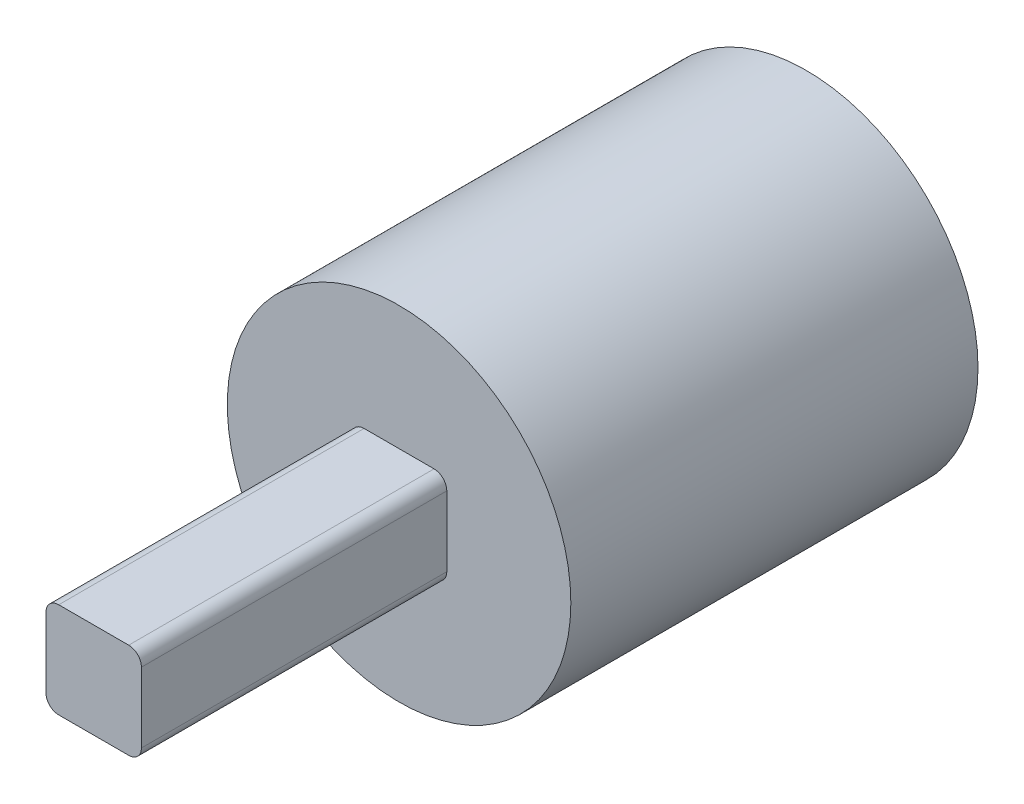
ISO-10303-21;
HEADER;
FILE_DESCRIPTION(('STEP AP214'),'2;1');
FILE_NAME('part.step','',(''),(''),'','','');
FILE_SCHEMA(('AUTOMOTIVE_DESIGN { 1 0 10303 214 1 1 1 1 }'));
ENDSEC;
DATA;
#1=APPLICATION_CONTEXT('core data for automotive mechanical design processes');
#2=APPLICATION_PROTOCOL_DEFINITION('international standard','automotive_design',2000,#1);
#3=PRODUCT_CONTEXT('',#1,'mechanical');
#4=PRODUCT('Part','Part','',(#3));
#5=PRODUCT_RELATED_PRODUCT_CATEGORY('part','',(#4));
#6=PRODUCT_DEFINITION_FORMATION('','',#4);
#7=PRODUCT_DEFINITION_CONTEXT('part definition',#1,'design');
#8=PRODUCT_DEFINITION('design','',#6,#7);
#9=PRODUCT_DEFINITION_SHAPE('','',#8);
#10=(LENGTH_UNIT() NAMED_UNIT(*) SI_UNIT(.MILLI.,.METRE.));
#11=(NAMED_UNIT(*) PLANE_ANGLE_UNIT() SI_UNIT($,.RADIAN.));
#12=(NAMED_UNIT(*) SI_UNIT($,.STERADIAN.) SOLID_ANGLE_UNIT());
#13=UNCERTAINTY_MEASURE_WITH_UNIT(LENGTH_MEASURE(1.E-05),#10,'distance_accuracy_value','');
#14=(GEOMETRIC_REPRESENTATION_CONTEXT(3) GLOBAL_UNCERTAINTY_ASSIGNED_CONTEXT((#13)) GLOBAL_UNIT_ASSIGNED_CONTEXT((#10,
#11,#12)) REPRESENTATION_CONTEXT('',''));
#15=CARTESIAN_POINT('',(0.,0.,0.));
#16=DIRECTION('',(0.,0.,1.));
#17=DIRECTION('',(1.,0.,0.));
#18=AXIS2_PLACEMENT_3D('',#15,#16,#17);
#19=CARTESIAN_POINT('',(0.,0.,32.));
#20=DIRECTION('',(0.,0.,-1.));
#21=DIRECTION('',(-1.,0.,0.));
#22=AXIS2_PLACEMENT_3D('',#19,#20,#21);
#23=CYLINDRICAL_SURFACE('',#22,13.5);
#24=CARTESIAN_POINT('',(0.,0.,32.));
#25=DIRECTION('',(0.,0.,1.));
#26=DIRECTION('',(1.,0.,0.));
#27=AXIS2_PLACEMENT_3D('',#24,#25,#26);
#28=CIRCLE('',#27,13.5);
#29=CARTESIAN_POINT('',(13.5,0.,32.));
#30=VERTEX_POINT('',#29);
#31=EDGE_CURVE('E11',#30,#30,#28,.T.);
#32=ORIENTED_EDGE('',*,*,#31,.F.);
#33=EDGE_LOOP('',(#32));
#34=FACE_BOUND('',#33,.T.);
#35=CARTESIAN_POINT('',(0.,0.,0.));
#36=DIRECTION('',(0.,0.,1.));
#37=DIRECTION('',(1.,0.,0.));
#38=AXIS2_PLACEMENT_3D('',#35,#36,#37);
#39=CIRCLE('',#38,13.5);
#40=CARTESIAN_POINT('',(13.5,0.,0.));
#41=VERTEX_POINT('',#40);
#42=EDGE_CURVE('E42',#41,#41,#39,.T.);
#43=ORIENTED_EDGE('',*,*,#42,.T.);
#44=EDGE_LOOP('',(#43));
#45=FACE_BOUND('',#44,.T.);
#46=ADVANCED_FACE('F39',(#34,#45),#23,.T.);
#47=CARTESIAN_POINT('',(0.,0.,32.));
#48=DIRECTION('',(0.,0.,1.));
#49=DIRECTION('',(1.,0.,0.));
#50=AXIS2_PLACEMENT_3D('',#47,#48,#49);
#51=PLANE('',#50);
#52=CARTESIAN_POINT('',(-2.75,-2.75,32.));
#53=DIRECTION('',(0.,0.,1.));
#54=DIRECTION('',(-1.,0.,0.));
#55=AXIS2_PLACEMENT_3D('',#52,#53,#54);
#56=CIRCLE('',#55,1.);
#57=CARTESIAN_POINT('',(-3.75,-2.75,32.));
#58=VERTEX_POINT('',#57);
#59=CARTESIAN_POINT('',(-2.75,-3.75,32.));
#60=VERTEX_POINT('',#59);
#61=EDGE_CURVE('E54',#58,#60,#56,.T.);
#62=ORIENTED_EDGE('',*,*,#61,.F.);
#63=DIRECTION('',(0.,-1.,0.));
#64=VECTOR('',#63,1.);
#65=CARTESIAN_POINT('',(-3.75,-2.75,32.));
#66=LINE('',#65,#64);
#67=CARTESIAN_POINT('',(-3.75,2.75,32.));
#68=VERTEX_POINT('',#67);
#69=EDGE_CURVE('E58',#68,#58,#66,.T.);
#70=ORIENTED_EDGE('',*,*,#69,.F.);
#71=CARTESIAN_POINT('',(-2.75,2.75,32.));
#72=DIRECTION('',(0.,0.,1.));
#73=DIRECTION('',(-1.,0.,0.));
#74=AXIS2_PLACEMENT_3D('',#71,#72,#73);
#75=CIRCLE('',#74,1.);
#76=CARTESIAN_POINT('',(-2.75,3.75,32.));
#77=VERTEX_POINT('',#76);
#78=EDGE_CURVE('E158',#77,#68,#75,.T.);
#79=ORIENTED_EDGE('',*,*,#78,.F.);
#80=DIRECTION('',(-1.,0.,0.));
#81=VECTOR('',#80,1.);
#82=CARTESIAN_POINT('',(-2.75,3.75,32.));
#83=LINE('',#82,#81);
#84=CARTESIAN_POINT('',(2.75,3.75,32.));
#85=VERTEX_POINT('',#84);
#86=EDGE_CURVE('E161',#85,#77,#83,.T.);
#87=ORIENTED_EDGE('',*,*,#86,.F.);
#88=CARTESIAN_POINT('',(2.75,2.75,32.));
#89=DIRECTION('',(0.,0.,1.));
#90=DIRECTION('',(-1.,0.,0.));
#91=AXIS2_PLACEMENT_3D('',#88,#89,#90);
#92=CIRCLE('',#91,1.);
#93=CARTESIAN_POINT('',(3.75,2.75,32.));
#94=VERTEX_POINT('',#93);
#95=EDGE_CURVE('E165',#94,#85,#92,.T.);
#96=ORIENTED_EDGE('',*,*,#95,.F.);
#97=DIRECTION('',(0.,1.,0.));
#98=VECTOR('',#97,1.);
#99=CARTESIAN_POINT('',(3.75,-2.75,32.));
#100=LINE('',#99,#98);
#101=CARTESIAN_POINT('',(3.75,-2.75,32.));
#102=VERTEX_POINT('',#101);
#103=EDGE_CURVE('E169',#102,#94,#100,.T.);
#104=ORIENTED_EDGE('',*,*,#103,.F.);
#105=CARTESIAN_POINT('',(2.75,-2.75,32.));
#106=DIRECTION('',(0.,0.,1.));
#107=DIRECTION('',(1.,0.,0.));
#108=AXIS2_PLACEMENT_3D('',#105,#106,#107);
#109=CIRCLE('',#108,1.);
#110=CARTESIAN_POINT('',(2.75,-3.75,32.));
#111=VERTEX_POINT('',#110);
#112=EDGE_CURVE('E173',#111,#102,#109,.T.);
#113=ORIENTED_EDGE('',*,*,#112,.F.);
#114=DIRECTION('',(1.,0.,0.));
#115=VECTOR('',#114,1.);
#116=CARTESIAN_POINT('',(-2.75,-3.75,32.));
#117=LINE('',#116,#115);
#118=EDGE_CURVE('E177',#60,#111,#117,.T.);
#119=ORIENTED_EDGE('',*,*,#118,.F.);
#120=EDGE_LOOP('',(#62,#70,#79,#87,#96,#104,#113,#119));
#121=FACE_BOUND('',#120,.T.);
#122=ORIENTED_EDGE('',*,*,#31,.T.);
#123=EDGE_LOOP('',(#122));
#124=FACE_BOUND('',#123,.T.);
#125=ADVANCED_FACE('F227',(#121,#124),#51,.T.);
#126=CARTESIAN_POINT('',(0.,0.,0.));
#127=DIRECTION('',(0.,0.,1.));
#128=DIRECTION('',(1.,0.,0.));
#129=AXIS2_PLACEMENT_3D('',#126,#127,#128);
#130=PLANE('',#129);
#131=ORIENTED_EDGE('',*,*,#42,.F.);
#132=EDGE_LOOP('',(#131));
#133=FACE_BOUND('',#132,.T.);
#134=ADVANCED_FACE('F232',(#133),#130,.F.);
#135=CARTESIAN_POINT('',(-2.75,-2.75,56.));
#136=DIRECTION('',(0.,0.,-1.));
#137=DIRECTION('',(-1.,0.,0.));
#138=AXIS2_PLACEMENT_3D('',#135,#136,#137);
#139=CYLINDRICAL_SURFACE('',#138,1.);
#140=ORIENTED_EDGE('',*,*,#61,.T.);
#141=DIRECTION('',(0.,0.,-1.));
#142=VECTOR('',#141,1.);
#143=CARTESIAN_POINT('',(-2.75,-3.75,56.));
#144=LINE('',#143,#142);
#145=CARTESIAN_POINT('',(-2.75,-3.75,56.));
#146=VERTEX_POINT('',#145);
#147=EDGE_CURVE('E107',#146,#60,#144,.T.);
#148=ORIENTED_EDGE('',*,*,#147,.F.);
#149=CARTESIAN_POINT('',(-2.75,-2.75,56.));
#150=DIRECTION('',(0.,0.,1.));
#151=DIRECTION('',(-1.,0.,0.));
#152=AXIS2_PLACEMENT_3D('',#149,#150,#151);
#153=CIRCLE('',#152,1.);
#154=CARTESIAN_POINT('',(-3.75,-2.75,56.));
#155=VERTEX_POINT('',#154);
#156=EDGE_CURVE('E114',#155,#146,#153,.T.);
#157=ORIENTED_EDGE('',*,*,#156,.F.);
#158=DIRECTION('',(0.,0.,-1.));
#159=VECTOR('',#158,1.);
#160=CARTESIAN_POINT('',(-3.75,-2.75,56.));
#161=LINE('',#160,#159);
#162=EDGE_CURVE('E153',#155,#58,#161,.T.);
#163=ORIENTED_EDGE('',*,*,#162,.T.);
#164=EDGE_LOOP('',(#140,#148,#157,#163));
#165=FACE_BOUND('',#164,.T.);
#166=ADVANCED_FACE('F125',(#165),#139,.T.);
#167=CARTESIAN_POINT('',(-2.75,-3.75,56.));
#168=DIRECTION('',(0.,1.,0.));
#169=DIRECTION('',(-1.,0.,0.));
#170=AXIS2_PLACEMENT_3D('',#167,#168,#169);
#171=PLANE('',#170);
#172=ORIENTED_EDGE('',*,*,#118,.T.);
#173=DIRECTION('',(0.,0.,-1.));
#174=VECTOR('',#173,1.);
#175=CARTESIAN_POINT('',(2.75,-3.75,56.));
#176=LINE('',#175,#174);
#177=CARTESIAN_POINT('',(2.75,-3.75,56.));
#178=VERTEX_POINT('',#177);
#179=EDGE_CURVE('E109',#178,#111,#176,.T.);
#180=ORIENTED_EDGE('',*,*,#179,.F.);
#181=DIRECTION('',(1.,0.,0.));
#182=VECTOR('',#181,1.);
#183=CARTESIAN_POINT('',(-2.75,-3.75,56.));
#184=LINE('',#183,#182);
#185=EDGE_CURVE('E102',#146,#178,#184,.T.);
#186=ORIENTED_EDGE('',*,*,#185,.F.);
#187=ORIENTED_EDGE('',*,*,#147,.T.);
#188=EDGE_LOOP('',(#172,#180,#186,#187));
#189=FACE_BOUND('',#188,.T.);
#190=ADVANCED_FACE('F105',(#189),#171,.F.);
#191=CARTESIAN_POINT('',(2.75,-2.75,56.));
#192=DIRECTION('',(0.,0.,-1.));
#193=DIRECTION('',(-1.,0.,0.));
#194=AXIS2_PLACEMENT_3D('',#191,#192,#193);
#195=CYLINDRICAL_SURFACE('',#194,1.);
#196=ORIENTED_EDGE('',*,*,#112,.T.);
#197=DIRECTION('',(0.,0.,-1.));
#198=VECTOR('',#197,1.);
#199=CARTESIAN_POINT('',(3.75,-2.75,56.));
#200=LINE('',#199,#198);
#201=CARTESIAN_POINT('',(3.75,-2.75,56.));
#202=VERTEX_POINT('',#201);
#203=EDGE_CURVE('E131',#202,#102,#200,.T.);
#204=ORIENTED_EDGE('',*,*,#203,.F.);
#205=CARTESIAN_POINT('',(2.75,-2.75,56.));
#206=DIRECTION('',(0.,0.,1.));
#207=DIRECTION('',(1.,0.,0.));
#208=AXIS2_PLACEMENT_3D('',#205,#206,#207);
#209=CIRCLE('',#208,1.);
#210=EDGE_CURVE('E113',#178,#202,#209,.T.);
#211=ORIENTED_EDGE('',*,*,#210,.F.);
#212=ORIENTED_EDGE('',*,*,#179,.T.);
#213=EDGE_LOOP('',(#196,#204,#211,#212));
#214=FACE_BOUND('',#213,.T.);
#215=ADVANCED_FACE('F201',(#214),#195,.T.);
#216=CARTESIAN_POINT('',(3.75,-2.75,56.));
#217=DIRECTION('',(-1.,0.,0.));
#218=DIRECTION('',(0.,0.,1.));
#219=AXIS2_PLACEMENT_3D('',#216,#217,#218);
#220=PLANE('',#219);
#221=ORIENTED_EDGE('',*,*,#103,.T.);
#222=DIRECTION('',(0.,0.,-1.));
#223=VECTOR('',#222,1.);
#224=CARTESIAN_POINT('',(3.75,2.75,56.));
#225=LINE('',#224,#223);
#226=CARTESIAN_POINT('',(3.75,2.75,56.));
#227=VERTEX_POINT('',#226);
#228=EDGE_CURVE('E137',#227,#94,#225,.T.);
#229=ORIENTED_EDGE('',*,*,#228,.F.);
#230=DIRECTION('',(0.,1.,0.));
#231=VECTOR('',#230,1.);
#232=CARTESIAN_POINT('',(3.75,-2.75,56.));
#233=LINE('',#232,#231);
#234=EDGE_CURVE('E193',#202,#227,#233,.T.);
#235=ORIENTED_EDGE('',*,*,#234,.F.);
#236=ORIENTED_EDGE('',*,*,#203,.T.);
#237=EDGE_LOOP('',(#221,#229,#235,#236));
#238=FACE_BOUND('',#237,.T.);
#239=ADVANCED_FACE('F203',(#238),#220,.F.);
#240=CARTESIAN_POINT('',(2.75,2.75,56.));
#241=DIRECTION('',(0.,0.,-1.));
#242=DIRECTION('',(-1.,0.,0.));
#243=AXIS2_PLACEMENT_3D('',#240,#241,#242);
#244=CYLINDRICAL_SURFACE('',#243,1.);
#245=ORIENTED_EDGE('',*,*,#95,.T.);
#246=DIRECTION('',(0.,0.,-1.));
#247=VECTOR('',#246,1.);
#248=CARTESIAN_POINT('',(2.75,3.75,56.));
#249=LINE('',#248,#247);
#250=CARTESIAN_POINT('',(2.75,3.75,56.));
#251=VERTEX_POINT('',#250);
#252=EDGE_CURVE('E141',#251,#85,#249,.T.);
#253=ORIENTED_EDGE('',*,*,#252,.F.);
#254=CARTESIAN_POINT('',(2.75,2.75,56.));
#255=DIRECTION('',(0.,0.,1.));
#256=DIRECTION('',(-1.,0.,0.));
#257=AXIS2_PLACEMENT_3D('',#254,#255,#256);
#258=CIRCLE('',#257,1.);
#259=EDGE_CURVE('E190',#227,#251,#258,.T.);
#260=ORIENTED_EDGE('',*,*,#259,.F.);
#261=ORIENTED_EDGE('',*,*,#228,.T.);
#262=EDGE_LOOP('',(#245,#253,#260,#261));
#263=FACE_BOUND('',#262,.T.);
#264=ADVANCED_FACE('F207',(#263),#244,.T.);
#265=CARTESIAN_POINT('',(-2.75,3.75,56.));
#266=DIRECTION('',(0.,-1.,0.));
#267=DIRECTION('',(1.,0.,0.));
#268=AXIS2_PLACEMENT_3D('',#265,#266,#267);
#269=PLANE('',#268);
#270=ORIENTED_EDGE('',*,*,#86,.T.);
#271=DIRECTION('',(0.,0.,-1.));
#272=VECTOR('',#271,1.);
#273=CARTESIAN_POINT('',(-2.75,3.75,56.));
#274=LINE('',#273,#272);
#275=CARTESIAN_POINT('',(-2.75,3.75,56.));
#276=VERTEX_POINT('',#275);
#277=EDGE_CURVE('E145',#276,#77,#274,.T.);
#278=ORIENTED_EDGE('',*,*,#277,.F.);
#279=DIRECTION('',(-1.,0.,0.));
#280=VECTOR('',#279,1.);
#281=CARTESIAN_POINT('',(-2.75,3.75,56.));
#282=LINE('',#281,#280);
#283=EDGE_CURVE('E187',#251,#276,#282,.T.);
#284=ORIENTED_EDGE('',*,*,#283,.F.);
#285=ORIENTED_EDGE('',*,*,#252,.T.);
#286=EDGE_LOOP('',(#270,#278,#284,#285));
#287=FACE_BOUND('',#286,.T.);
#288=ADVANCED_FACE('F213',(#287),#269,.F.);
#289=CARTESIAN_POINT('',(-2.75,2.75,56.));
#290=DIRECTION('',(0.,0.,-1.));
#291=DIRECTION('',(-1.,0.,0.));
#292=AXIS2_PLACEMENT_3D('',#289,#290,#291);
#293=CYLINDRICAL_SURFACE('',#292,1.);
#294=ORIENTED_EDGE('',*,*,#78,.T.);
#295=DIRECTION('',(0.,0.,-1.));
#296=VECTOR('',#295,1.);
#297=CARTESIAN_POINT('',(-3.75,2.75,56.));
#298=LINE('',#297,#296);
#299=CARTESIAN_POINT('',(-3.75,2.75,56.));
#300=VERTEX_POINT('',#299);
#301=EDGE_CURVE('E149',#300,#68,#298,.T.);
#302=ORIENTED_EDGE('',*,*,#301,.F.);
#303=CARTESIAN_POINT('',(-2.75,2.75,56.));
#304=DIRECTION('',(0.,0.,1.));
#305=DIRECTION('',(-1.,0.,0.));
#306=AXIS2_PLACEMENT_3D('',#303,#304,#305);
#307=CIRCLE('',#306,1.);
#308=EDGE_CURVE('E184',#276,#300,#307,.T.);
#309=ORIENTED_EDGE('',*,*,#308,.F.);
#310=ORIENTED_EDGE('',*,*,#277,.T.);
#311=EDGE_LOOP('',(#294,#302,#309,#310));
#312=FACE_BOUND('',#311,.T.);
#313=ADVANCED_FACE('F215',(#312),#293,.T.);
#314=CARTESIAN_POINT('',(-3.75,-2.75,56.));
#315=DIRECTION('',(1.,0.,0.));
#316=DIRECTION('',(0.,1.,0.));
#317=AXIS2_PLACEMENT_3D('',#314,#315,#316);
#318=PLANE('',#317);
#319=ORIENTED_EDGE('',*,*,#69,.T.);
#320=ORIENTED_EDGE('',*,*,#162,.F.);
#321=DIRECTION('',(0.,-1.,0.));
#322=VECTOR('',#321,1.);
#323=CARTESIAN_POINT('',(-3.75,-2.75,56.));
#324=LINE('',#323,#322);
#325=EDGE_CURVE('E119',#300,#155,#324,.T.);
#326=ORIENTED_EDGE('',*,*,#325,.F.);
#327=ORIENTED_EDGE('',*,*,#301,.T.);
#328=EDGE_LOOP('',(#319,#320,#326,#327));
#329=FACE_BOUND('',#328,.T.);
#330=ADVANCED_FACE('F217',(#329),#318,.F.);
#331=CARTESIAN_POINT('',(-2.75,-2.75,56.));
#332=DIRECTION('',(0.,0.,-1.));
#333=DIRECTION('',(-1.,0.,0.));
#334=AXIS2_PLACEMENT_3D('',#331,#332,#333);
#335=PLANE('',#334);
#336=ORIENTED_EDGE('',*,*,#156,.T.);
#337=ORIENTED_EDGE('',*,*,#185,.T.);
#338=ORIENTED_EDGE('',*,*,#210,.T.);
#339=ORIENTED_EDGE('',*,*,#234,.T.);
#340=ORIENTED_EDGE('',*,*,#259,.T.);
#341=ORIENTED_EDGE('',*,*,#283,.T.);
#342=ORIENTED_EDGE('',*,*,#308,.T.);
#343=ORIENTED_EDGE('',*,*,#325,.T.);
#344=EDGE_LOOP('',(#336,#337,#338,#339,#340,#341,#342,#343));
#345=FACE_BOUND('',#344,.T.);
#346=ADVANCED_FACE('F117',(#345),#335,.F.);
#347=CLOSED_SHELL('',(#46,#125,#134,#166,#190,#215,#239,#264,#288,#313,#330,#346));
#348=MANIFOLD_SOLID_BREP('B2',#347);
#349=ADVANCED_BREP_SHAPE_REPRESENTATION('',(#18,#348),#14);
#350=SHAPE_DEFINITION_REPRESENTATION(#9,#349);
ENDSEC;
END-ISO-10303-21;
